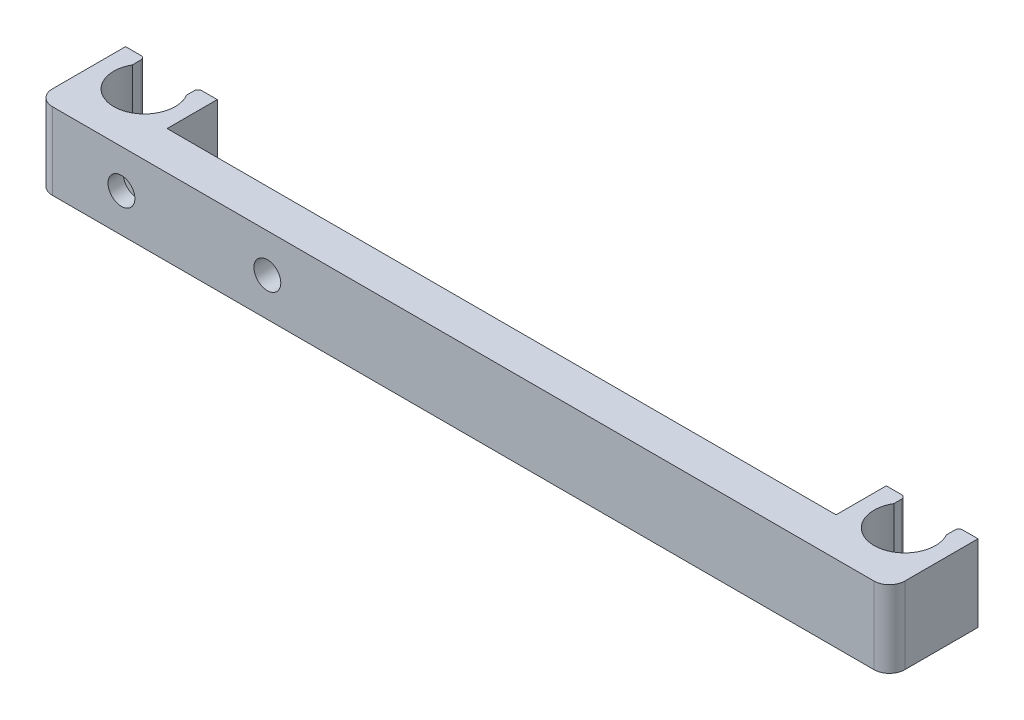
ISO-10303-21;
HEADER;
FILE_DESCRIPTION(('STEP AP214'),'2;1');
FILE_NAME('part.step','',(''),(''),'','','');
FILE_SCHEMA(('AUTOMOTIVE_DESIGN { 1 0 10303 214 1 1 1 1 }'));
ENDSEC;
DATA;
#1=APPLICATION_CONTEXT('core data for automotive mechanical design processes');
#2=APPLICATION_PROTOCOL_DEFINITION('international standard','automotive_design',2000,#1);
#3=PRODUCT_CONTEXT('',#1,'mechanical');
#4=PRODUCT('Part','Part','',(#3));
#5=PRODUCT_RELATED_PRODUCT_CATEGORY('part','',(#4));
#6=PRODUCT_DEFINITION_FORMATION('','',#4);
#7=PRODUCT_DEFINITION_CONTEXT('part definition',#1,'design');
#8=PRODUCT_DEFINITION('design','',#6,#7);
#9=PRODUCT_DEFINITION_SHAPE('','',#8);
#10=(LENGTH_UNIT() NAMED_UNIT(*) SI_UNIT(.MILLI.,.METRE.));
#11=(NAMED_UNIT(*) PLANE_ANGLE_UNIT() SI_UNIT($,.RADIAN.));
#12=(NAMED_UNIT(*) SI_UNIT($,.STERADIAN.) SOLID_ANGLE_UNIT());
#13=UNCERTAINTY_MEASURE_WITH_UNIT(LENGTH_MEASURE(1.E-05),#10,'distance_accuracy_value','');
#14=(GEOMETRIC_REPRESENTATION_CONTEXT(3) GLOBAL_UNCERTAINTY_ASSIGNED_CONTEXT((#13)) GLOBAL_UNIT_ASSIGNED_CONTEXT((#10,
#11,#12)) REPRESENTATION_CONTEXT('',''));
#15=CARTESIAN_POINT('',(0.,0.,0.));
#16=DIRECTION('',(0.,0.,1.));
#17=DIRECTION('',(1.,0.,0.));
#18=AXIS2_PLACEMENT_3D('',#15,#16,#17);
#19=CARTESIAN_POINT('',(-45.5572247146555,10.,-11.0364916731037));
#20=DIRECTION('',(0.,1.,0.));
#21=DIRECTION('',(0.,0.,1.));
#22=AXIS2_PLACEMENT_3D('',#19,#20,#21);
#23=CYLINDRICAL_SURFACE('',#22,0.5);
#24=DIRECTION('',(0.,-1.,0.));
#25=VECTOR('',#24,1.);
#26=CARTESIAN_POINT('',(-46.0572247146555,10.,-11.0364916731037));
#27=LINE('',#26,#25);
#28=CARTESIAN_POINT('',(-46.0572247146555,10.,-11.0364916731037));
#29=VERTEX_POINT('',#28);
#30=CARTESIAN_POINT('',(-46.0572247146555,0.,-11.0364916731037));
#31=VERTEX_POINT('',#30);
#32=EDGE_CURVE('E262',#29,#31,#27,.T.);
#33=ORIENTED_EDGE('',*,*,#32,.F.);
#34=CARTESIAN_POINT('',(-45.5572247146555,10.,-11.0364916731037));
#35=DIRECTION('',(0.,-1.,0.));
#36=DIRECTION('',(0.,0.,-1.));
#37=AXIS2_PLACEMENT_3D('',#34,#35,#36);
#38=CIRCLE('',#37,0.5);
#39=CARTESIAN_POINT('',(-45.5572247146555,10.,-11.5364916731037));
#40=VERTEX_POINT('',#39);
#41=EDGE_CURVE('E41',#40,#29,#38,.F.);
#42=ORIENTED_EDGE('',*,*,#41,.F.);
#43=DIRECTION('',(0.,-1.,0.));
#44=VECTOR('',#43,1.);
#45=CARTESIAN_POINT('',(-45.5572247146555,10.,-11.5364916731037));
#46=LINE('',#45,#44);
#47=CARTESIAN_POINT('',(-45.5572247146555,0.,-11.5364916731037));
#48=VERTEX_POINT('',#47);
#49=EDGE_CURVE('E265',#48,#40,#46,.F.);
#50=ORIENTED_EDGE('',*,*,#49,.F.);
#51=CARTESIAN_POINT('',(-45.5572247146555,0.,-11.0364916731037));
#52=DIRECTION('',(0.,-1.,0.));
#53=DIRECTION('',(0.,0.,-1.));
#54=AXIS2_PLACEMENT_3D('',#51,#52,#53);
#55=CIRCLE('',#54,0.5);
#56=EDGE_CURVE('E11',#31,#48,#55,.T.);
#57=ORIENTED_EDGE('',*,*,#56,.F.);
#58=EDGE_LOOP('',(#33,#42,#50,#57));
#59=FACE_BOUND('',#58,.T.);
#60=ADVANCED_FACE('F34',(#59),#23,.T.);
#61=CARTESIAN_POINT('',(-53.5,10.,-11.0364916731037));
#62=DIRECTION('',(0.,1.,0.));
#63=DIRECTION('',(0.,0.,1.));
#64=AXIS2_PLACEMENT_3D('',#61,#62,#63);
#65=CYLINDRICAL_SURFACE('',#64,0.5);
#66=DIRECTION('',(0.,1.,0.));
#67=VECTOR('',#66,1.);
#68=CARTESIAN_POINT('',(-53.,10.,-11.0364916731037));
#69=LINE('',#68,#67);
#70=CARTESIAN_POINT('',(-53.,0.,-11.0364916731037));
#71=VERTEX_POINT('',#70);
#72=CARTESIAN_POINT('',(-53.,10.,-11.0364916731037));
#73=VERTEX_POINT('',#72);
#74=EDGE_CURVE('E252',#71,#73,#69,.T.);
#75=ORIENTED_EDGE('',*,*,#74,.F.);
#76=CARTESIAN_POINT('',(-53.5,0.,-11.0364916731037));
#77=DIRECTION('',(0.,-1.,0.));
#78=DIRECTION('',(0.,0.,-1.));
#79=AXIS2_PLACEMENT_3D('',#76,#77,#78);
#80=CIRCLE('',#79,0.5);
#81=CARTESIAN_POINT('',(-53.5,0.,-11.5364916731037));
#82=VERTEX_POINT('',#81);
#83=EDGE_CURVE('E258',#82,#71,#80,.T.);
#84=ORIENTED_EDGE('',*,*,#83,.F.);
#85=DIRECTION('',(0.,1.,0.));
#86=VECTOR('',#85,1.);
#87=CARTESIAN_POINT('',(-53.5,10.,-11.5364916731037));
#88=LINE('',#87,#86);
#89=CARTESIAN_POINT('',(-53.5,10.,-11.5364916731037));
#90=VERTEX_POINT('',#89);
#91=EDGE_CURVE('E255',#90,#82,#88,.F.);
#92=ORIENTED_EDGE('',*,*,#91,.F.);
#93=CARTESIAN_POINT('',(-53.5,10.,-11.0364916731037));
#94=DIRECTION('',(0.,-1.,0.));
#95=DIRECTION('',(0.,0.,-1.));
#96=AXIS2_PLACEMENT_3D('',#93,#94,#95);
#97=CIRCLE('',#96,0.5);
#98=EDGE_CURVE('E260',#73,#90,#97,.F.);
#99=ORIENTED_EDGE('',*,*,#98,.F.);
#100=EDGE_LOOP('',(#75,#84,#92,#99));
#101=FACE_BOUND('',#100,.T.);
#102=ADVANCED_FACE('F425',(#101),#65,.T.);
#103=CARTESIAN_POINT('',(53.5,10.,-11.0364916731037));
#104=DIRECTION('',(0.,-1.,0.));
#105=DIRECTION('',(0.,0.,-1.));
#106=AXIS2_PLACEMENT_3D('',#103,#104,#105);
#107=CYLINDRICAL_SURFACE('',#106,0.5);
#108=DIRECTION('',(0.,-1.,0.));
#109=VECTOR('',#108,1.);
#110=CARTESIAN_POINT('',(53.,10.,-11.0364916731037));
#111=LINE('',#110,#109);
#112=CARTESIAN_POINT('',(53.,10.,-11.0364916731037));
#113=VERTEX_POINT('',#112);
#114=CARTESIAN_POINT('',(53.,0.,-11.0364916731037));
#115=VERTEX_POINT('',#114);
#116=EDGE_CURVE('E242',#113,#115,#111,.T.);
#117=ORIENTED_EDGE('',*,*,#116,.F.);
#118=CARTESIAN_POINT('',(53.5,10.,-11.0364916731037));
#119=DIRECTION('',(0.,-1.,0.));
#120=DIRECTION('',(0.,0.,-1.));
#121=AXIS2_PLACEMENT_3D('',#118,#119,#120);
#122=CIRCLE('',#121,0.5);
#123=CARTESIAN_POINT('',(53.5,10.,-11.5364916731037));
#124=VERTEX_POINT('',#123);
#125=EDGE_CURVE('E248',#124,#113,#122,.F.);
#126=ORIENTED_EDGE('',*,*,#125,.F.);
#127=DIRECTION('',(0.,-1.,0.));
#128=VECTOR('',#127,1.);
#129=CARTESIAN_POINT('',(53.5,10.,-11.5364916731037));
#130=LINE('',#129,#128);
#131=CARTESIAN_POINT('',(53.5,0.,-11.5364916731037));
#132=VERTEX_POINT('',#131);
#133=EDGE_CURVE('E245',#132,#124,#130,.F.);
#134=ORIENTED_EDGE('',*,*,#133,.F.);
#135=CARTESIAN_POINT('',(53.5,0.,-11.0364916731037));
#136=DIRECTION('',(0.,-1.,0.));
#137=DIRECTION('',(0.,0.,-1.));
#138=AXIS2_PLACEMENT_3D('',#135,#136,#137);
#139=CIRCLE('',#138,0.5);
#140=EDGE_CURVE('E250',#115,#132,#139,.T.);
#141=ORIENTED_EDGE('',*,*,#140,.F.);
#142=EDGE_LOOP('',(#117,#126,#134,#141));
#143=FACE_BOUND('',#142,.T.);
#144=ADVANCED_FACE('F389',(#143),#107,.T.);
#145=CARTESIAN_POINT('',(45.5572247146555,10.,-11.0364916731037));
#146=DIRECTION('',(0.,-1.,0.));
#147=DIRECTION('',(0.,0.,-1.));
#148=AXIS2_PLACEMENT_3D('',#145,#146,#147);
#149=CYLINDRICAL_SURFACE('',#148,0.5);
#150=DIRECTION('',(0.,1.,0.));
#151=VECTOR('',#150,1.);
#152=CARTESIAN_POINT('',(46.0572247146555,10.,-11.0364916731037));
#153=LINE('',#152,#151);
#154=CARTESIAN_POINT('',(46.0572247146555,0.,-11.0364916731037));
#155=VERTEX_POINT('',#154);
#156=CARTESIAN_POINT('',(46.0572247146555,10.,-11.0364916731037));
#157=VERTEX_POINT('',#156);
#158=EDGE_CURVE('E232',#155,#157,#153,.T.);
#159=ORIENTED_EDGE('',*,*,#158,.F.);
#160=CARTESIAN_POINT('',(45.5572247146555,0.,-11.0364916731037));
#161=DIRECTION('',(0.,-1.,0.));
#162=DIRECTION('',(0.,0.,-1.));
#163=AXIS2_PLACEMENT_3D('',#160,#161,#162);
#164=CIRCLE('',#163,0.5);
#165=CARTESIAN_POINT('',(45.5572247146555,0.,-11.5364916731037));
#166=VERTEX_POINT('',#165);
#167=EDGE_CURVE('E238',#166,#155,#164,.T.);
#168=ORIENTED_EDGE('',*,*,#167,.F.);
#169=DIRECTION('',(0.,1.,0.));
#170=VECTOR('',#169,1.);
#171=CARTESIAN_POINT('',(45.5572247146555,10.,-11.5364916731037));
#172=LINE('',#171,#170);
#173=CARTESIAN_POINT('',(45.5572247146555,10.,-11.5364916731037));
#174=VERTEX_POINT('',#173);
#175=EDGE_CURVE('E235',#174,#166,#172,.F.);
#176=ORIENTED_EDGE('',*,*,#175,.F.);
#177=CARTESIAN_POINT('',(45.5572247146555,10.,-11.0364916731037));
#178=DIRECTION('',(0.,-1.,0.));
#179=DIRECTION('',(0.,0.,-1.));
#180=AXIS2_PLACEMENT_3D('',#177,#178,#179);
#181=CIRCLE('',#180,0.5);
#182=EDGE_CURVE('E240',#157,#174,#181,.F.);
#183=ORIENTED_EDGE('',*,*,#182,.F.);
#184=EDGE_LOOP('',(#159,#168,#176,#183));
#185=FACE_BOUND('',#184,.T.);
#186=ADVANCED_FACE('F372',(#185),#149,.T.);
#187=CARTESIAN_POINT('',(-53.5,10.,-2.));
#188=DIRECTION('',(0.,-1.,0.));
#189=DIRECTION('',(0.,0.,-1.));
#190=AXIS2_PLACEMENT_3D('',#187,#188,#189);
#191=CYLINDRICAL_SURFACE('',#190,2.);
#192=DIRECTION('',(0.,1.,0.));
#193=VECTOR('',#192,1.);
#194=CARTESIAN_POINT('',(-55.5,10.,-2.));
#195=LINE('',#194,#193);
#196=CARTESIAN_POINT('',(-55.5,0.,-2.));
#197=VERTEX_POINT('',#196);
#198=CARTESIAN_POINT('',(-55.5,10.,-2.));
#199=VERTEX_POINT('',#198);
#200=EDGE_CURVE('E222',#197,#199,#195,.T.);
#201=ORIENTED_EDGE('',*,*,#200,.F.);
#202=CARTESIAN_POINT('',(-53.5,0.,-2.));
#203=DIRECTION('',(0.,-1.,0.));
#204=DIRECTION('',(0.,0.,-1.));
#205=AXIS2_PLACEMENT_3D('',#202,#203,#204);
#206=CIRCLE('',#205,2.);
#207=CARTESIAN_POINT('',(-53.5,0.,0.));
#208=VERTEX_POINT('',#207);
#209=EDGE_CURVE('E228',#208,#197,#206,.T.);
#210=ORIENTED_EDGE('',*,*,#209,.F.);
#211=DIRECTION('',(0.,1.,0.));
#212=VECTOR('',#211,1.);
#213=CARTESIAN_POINT('',(-53.5,10.,0.));
#214=LINE('',#213,#212);
#215=CARTESIAN_POINT('',(-53.5,10.,0.));
#216=VERTEX_POINT('',#215);
#217=EDGE_CURVE('E225',#216,#208,#214,.F.);
#218=ORIENTED_EDGE('',*,*,#217,.F.);
#219=CARTESIAN_POINT('',(-53.5,10.,-2.));
#220=DIRECTION('',(0.,-1.,0.));
#221=DIRECTION('',(0.,0.,-1.));
#222=AXIS2_PLACEMENT_3D('',#219,#220,#221);
#223=CIRCLE('',#222,2.);
#224=EDGE_CURVE('E230',#199,#216,#223,.F.);
#225=ORIENTED_EDGE('',*,*,#224,.F.);
#226=EDGE_LOOP('',(#201,#210,#218,#225));
#227=FACE_BOUND('',#226,.T.);
#228=ADVANCED_FACE('F412',(#227),#191,.T.);
#229=CARTESIAN_POINT('',(53.5,10.,-2.));
#230=DIRECTION('',(0.,-1.,0.));
#231=DIRECTION('',(0.,0.,-1.));
#232=AXIS2_PLACEMENT_3D('',#229,#230,#231);
#233=CYLINDRICAL_SURFACE('',#232,2.);
#234=DIRECTION('',(0.,-1.,0.));
#235=VECTOR('',#234,1.);
#236=CARTESIAN_POINT('',(55.5,10.,-2.));
#237=LINE('',#236,#235);
#238=CARTESIAN_POINT('',(55.5,10.,-2.));
#239=VERTEX_POINT('',#238);
#240=CARTESIAN_POINT('',(55.5,0.,-2.));
#241=VERTEX_POINT('',#240);
#242=EDGE_CURVE('E206',#239,#241,#237,.T.);
#243=ORIENTED_EDGE('',*,*,#242,.F.);
#244=CARTESIAN_POINT('',(53.5,10.,-2.));
#245=DIRECTION('',(0.,-1.,0.));
#246=DIRECTION('',(0.,0.,-1.));
#247=AXIS2_PLACEMENT_3D('',#244,#245,#246);
#248=CIRCLE('',#247,2.);
#249=CARTESIAN_POINT('',(53.5,10.,0.));
#250=VERTEX_POINT('',#249);
#251=EDGE_CURVE('E217',#250,#239,#248,.F.);
#252=ORIENTED_EDGE('',*,*,#251,.F.);
#253=DIRECTION('',(0.,-1.,0.));
#254=VECTOR('',#253,1.);
#255=CARTESIAN_POINT('',(53.5,10.,0.));
#256=LINE('',#255,#254);
#257=CARTESIAN_POINT('',(53.5,0.,0.));
#258=VERTEX_POINT('',#257);
#259=EDGE_CURVE('E209',#258,#250,#256,.F.);
#260=ORIENTED_EDGE('',*,*,#259,.F.);
#261=CARTESIAN_POINT('',(53.5,0.,-2.));
#262=DIRECTION('',(0.,-1.,0.));
#263=DIRECTION('',(0.,0.,-1.));
#264=AXIS2_PLACEMENT_3D('',#261,#262,#263);
#265=CIRCLE('',#264,2.);
#266=EDGE_CURVE('E219',#241,#258,#265,.T.);
#267=ORIENTED_EDGE('',*,*,#266,.F.);
#268=EDGE_LOOP('',(#243,#252,#260,#267));
#269=FACE_BOUND('',#268,.T.);
#270=ADVANCED_FACE('F403',(#269),#233,.T.);
#271=CARTESIAN_POINT('',(43.5572247146555,10.,-11.5364916731037));
#272=DIRECTION('',(1.,0.,0.));
#273=DIRECTION('',(0.,0.,-1.));
#274=AXIS2_PLACEMENT_3D('',#271,#272,#273);
#275=PLANE('',#274);
#276=DIRECTION('',(0.,0.,1.));
#277=VECTOR('',#276,1.);
#278=CARTESIAN_POINT('',(43.5572247146555,0.,-11.5364916731037));
#279=LINE('',#278,#277);
#280=CARTESIAN_POINT('',(43.5572247146555,0.,-11.5364916731037));
#281=VERTEX_POINT('',#280);
#282=CARTESIAN_POINT('',(43.5572247146555,0.,-4.99999999999999));
#283=VERTEX_POINT('',#282);
#284=EDGE_CURVE('E205',#281,#283,#279,.T.);
#285=ORIENTED_EDGE('',*,*,#284,.T.);
#286=DIRECTION('',(0.,-1.,0.));
#287=VECTOR('',#286,1.);
#288=CARTESIAN_POINT('',(43.5572247146555,10.,-4.99999999999999));
#289=LINE('',#288,#287);
#290=CARTESIAN_POINT('',(43.5572247146555,10.,-4.99999999999999));
#291=VERTEX_POINT('',#290);
#292=EDGE_CURVE('E184',#291,#283,#289,.T.);
#293=ORIENTED_EDGE('',*,*,#292,.F.);
#294=DIRECTION('',(0.,0.,1.));
#295=VECTOR('',#294,1.);
#296=CARTESIAN_POINT('',(43.5572247146555,10.,-11.5364916731037));
#297=LINE('',#296,#295);
#298=CARTESIAN_POINT('',(43.5572247146555,10.,-11.5364916731037));
#299=VERTEX_POINT('',#298);
#300=EDGE_CURVE('E191',#299,#291,#297,.T.);
#301=ORIENTED_EDGE('',*,*,#300,.F.);
#302=DIRECTION('',(0.,-1.,0.));
#303=VECTOR('',#302,1.);
#304=CARTESIAN_POINT('',(43.5572247146555,10.,-11.5364916731037));
#305=LINE('',#304,#303);
#306=EDGE_CURVE('E304',#299,#281,#305,.T.);
#307=ORIENTED_EDGE('',*,*,#306,.T.);
#308=EDGE_LOOP('',(#285,#293,#301,#307));
#309=FACE_BOUND('',#308,.T.);
#310=ADVANCED_FACE('F203',(#309),#275,.F.);
#311=CARTESIAN_POINT('',(43.5572247146555,10.,-4.99999999999999));
#312=DIRECTION('',(0.,0.,1.));
#313=DIRECTION('',(1.,0.,0.));
#314=AXIS2_PLACEMENT_3D('',#311,#312,#313);
#315=PLANE('',#314);
#316=CARTESIAN_POINT('',(-25.5,5.,-5.));
#317=DIRECTION('',(0.,0.,1.));
#318=DIRECTION('',(1.,0.,0.));
#319=AXIS2_PLACEMENT_3D('',#316,#317,#318);
#320=CIRCLE('',#319,1.75);
#321=CARTESIAN_POINT('',(-23.75,5.,-5.));
#322=VERTEX_POINT('',#321);
#323=EDGE_CURVE('E307',#322,#322,#320,.T.);
#324=ORIENTED_EDGE('',*,*,#323,.T.);
#325=EDGE_LOOP('',(#324));
#326=FACE_BOUND('',#325,.T.);
#327=DIRECTION('',(-1.,0.,0.));
#328=VECTOR('',#327,1.);
#329=CARTESIAN_POINT('',(43.5572247146555,0.,-4.99999999999999));
#330=LINE('',#329,#328);
#331=CARTESIAN_POINT('',(-43.5572247146555,0.,-4.99999999999999));
#332=VERTEX_POINT('',#331);
#333=EDGE_CURVE('E306',#283,#332,#330,.T.);
#334=ORIENTED_EDGE('',*,*,#333,.T.);
#335=DIRECTION('',(0.,-1.,0.));
#336=VECTOR('',#335,1.);
#337=CARTESIAN_POINT('',(-43.5572247146555,10.,-4.99999999999999));
#338=LINE('',#337,#336);
#339=CARTESIAN_POINT('',(-43.5572247146555,10.,-4.99999999999999));
#340=VERTEX_POINT('',#339);
#341=EDGE_CURVE('E186',#340,#332,#338,.T.);
#342=ORIENTED_EDGE('',*,*,#341,.F.);
#343=DIRECTION('',(-1.,0.,0.));
#344=VECTOR('',#343,1.);
#345=CARTESIAN_POINT('',(43.5572247146555,10.,-4.99999999999999));
#346=LINE('',#345,#344);
#347=EDGE_CURVE('E179',#291,#340,#346,.T.);
#348=ORIENTED_EDGE('',*,*,#347,.F.);
#349=ORIENTED_EDGE('',*,*,#292,.T.);
#350=EDGE_LOOP('',(#334,#342,#348,#349));
#351=FACE_BOUND('',#350,.T.);
#352=ADVANCED_FACE('F182',(#326,#351),#315,.F.);
#353=CARTESIAN_POINT('',(-43.5572247146555,10.,-11.5364916731037));
#354=DIRECTION('',(1.,0.,0.));
#355=DIRECTION('',(0.,0.,-1.));
#356=AXIS2_PLACEMENT_3D('',#353,#354,#355);
#357=PLANE('',#356);
#358=DIRECTION('',(0.,0.,1.));
#359=VECTOR('',#358,1.);
#360=CARTESIAN_POINT('',(-43.5572247146555,0.,-11.5364916731037));
#361=LINE('',#360,#359);
#362=CARTESIAN_POINT('',(-43.5572247146555,0.,-11.5364916731037));
#363=VERTEX_POINT('',#362);
#364=EDGE_CURVE('E309',#363,#332,#361,.T.);
#365=ORIENTED_EDGE('',*,*,#364,.F.);
#366=DIRECTION('',(0.,-1.,0.));
#367=VECTOR('',#366,1.);
#368=CARTESIAN_POINT('',(-43.5572247146555,10.,-11.5364916731037));
#369=LINE('',#368,#367);
#370=CARTESIAN_POINT('',(-43.5572247146555,10.,-11.5364916731037));
#371=VERTEX_POINT('',#370);
#372=EDGE_CURVE('E211',#371,#363,#369,.T.);
#373=ORIENTED_EDGE('',*,*,#372,.F.);
#374=DIRECTION('',(0.,0.,1.));
#375=VECTOR('',#374,1.);
#376=CARTESIAN_POINT('',(-43.5572247146555,10.,-11.5364916731037));
#377=LINE('',#376,#375);
#378=EDGE_CURVE('E190',#371,#340,#377,.T.);
#379=ORIENTED_EDGE('',*,*,#378,.T.);
#380=ORIENTED_EDGE('',*,*,#341,.T.);
#381=EDGE_LOOP('',(#365,#373,#379,#380));
#382=FACE_BOUND('',#381,.T.);
#383=ADVANCED_FACE('F364',(#382),#357,.T.);
#384=CARTESIAN_POINT('',(-46.0572247146555,10.,-11.5364916731037));
#385=DIRECTION('',(0.,0.,-1.));
#386=DIRECTION('',(-1.,0.,0.));
#387=AXIS2_PLACEMENT_3D('',#384,#385,#386);
#388=PLANE('',#387);
#389=DIRECTION('',(1.,0.,0.));
#390=VECTOR('',#389,1.);
#391=CARTESIAN_POINT('',(-46.0572247146555,0.,-11.5364916731037));
#392=LINE('',#391,#390);
#393=EDGE_CURVE('E312',#48,#363,#392,.T.);
#394=ORIENTED_EDGE('',*,*,#393,.F.);
#395=ORIENTED_EDGE('',*,*,#49,.T.);
#396=DIRECTION('',(1.,0.,0.));
#397=VECTOR('',#396,1.);
#398=CARTESIAN_POINT('',(-46.0572247146555,10.,-11.5364916731037));
#399=LINE('',#398,#397);
#400=EDGE_CURVE('E270',#40,#371,#399,.T.);
#401=ORIENTED_EDGE('',*,*,#400,.T.);
#402=ORIENTED_EDGE('',*,*,#372,.T.);
#403=EDGE_LOOP('',(#394,#395,#401,#402));
#404=FACE_BOUND('',#403,.T.);
#405=ADVANCED_FACE('F362',(#404),#388,.T.);
#406=CARTESIAN_POINT('',(-46.0572247146555,10.,-11.5364916731037));
#407=DIRECTION('',(1.,0.,0.));
#408=DIRECTION('',(0.,0.,-1.));
#409=AXIS2_PLACEMENT_3D('',#406,#407,#408);
#410=PLANE('',#409);
#411=DIRECTION('',(0.,0.,1.));
#412=VECTOR('',#411,1.);
#413=CARTESIAN_POINT('',(-46.0572247146555,10.,-11.5364916731037));
#414=LINE('',#413,#412);
#415=CARTESIAN_POINT('',(-46.0572247146555,10.,-10.0364916731037));
#416=VERTEX_POINT('',#415);
#417=EDGE_CURVE('E268',#29,#416,#414,.T.);
#418=ORIENTED_EDGE('',*,*,#417,.F.);
#419=ORIENTED_EDGE('',*,*,#32,.T.);
#420=DIRECTION('',(0.,0.,1.));
#421=VECTOR('',#420,1.);
#422=CARTESIAN_POINT('',(-46.0572247146555,0.,-11.5364916731037));
#423=LINE('',#422,#421);
#424=CARTESIAN_POINT('',(-46.0572247146555,0.,-10.0364916731037));
#425=VERTEX_POINT('',#424);
#426=EDGE_CURVE('E314',#31,#425,#423,.T.);
#427=ORIENTED_EDGE('',*,*,#426,.T.);
#428=DIRECTION('',(0.,-1.,0.));
#429=VECTOR('',#428,1.);
#430=CARTESIAN_POINT('',(-46.0572247146555,10.,-10.0364916731037));
#431=LINE('',#430,#429);
#432=EDGE_CURVE('E274',#416,#425,#431,.T.);
#433=ORIENTED_EDGE('',*,*,#432,.F.);
#434=EDGE_LOOP('',(#418,#419,#427,#433));
#435=FACE_BOUND('',#434,.T.);
#436=ADVANCED_FACE('F272',(#435),#410,.F.);
#437=CARTESIAN_POINT('',(-49.5,10.,-8.00000000000001));
#438=DIRECTION('',(0.,-1.,0.));
#439=DIRECTION('',(0.,0.,-1.));
#440=AXIS2_PLACEMENT_3D('',#437,#438,#439);
#441=CYLINDRICAL_SURFACE('',#440,3.99999999999998);
#442=CARTESIAN_POINT('',(-49.5,0.,-8.00000000000001));
#443=DIRECTION('',(0.,-1.,0.));
#444=DIRECTION('',(0.,0.,-1.));
#445=AXIS2_PLACEMENT_3D('',#442,#443,#444);
#446=CIRCLE('',#445,3.99999999999998);
#447=CARTESIAN_POINT('',(-53.,0.,-9.93649167310367));
#448=VERTEX_POINT('',#447);
#449=EDGE_CURVE('E316',#425,#448,#446,.T.);
#450=ORIENTED_EDGE('',*,*,#449,.T.);
#451=DIRECTION('',(0.,-1.,0.));
#452=VECTOR('',#451,1.);
#453=CARTESIAN_POINT('',(-53.,10.,-9.93649167310367));
#454=LINE('',#453,#452);
#455=CARTESIAN_POINT('',(-53.,10.,-9.93649167310367));
#456=VERTEX_POINT('',#455);
#457=EDGE_CURVE('E354',#456,#448,#454,.T.);
#458=ORIENTED_EDGE('',*,*,#457,.F.);
#459=CARTESIAN_POINT('',(-49.5,10.,-8.00000000000001));
#460=DIRECTION('',(0.,-1.,0.));
#461=DIRECTION('',(0.,0.,-1.));
#462=AXIS2_PLACEMENT_3D('',#459,#460,#461);
#463=CIRCLE('',#462,3.99999999999998);
#464=EDGE_CURVE('E276',#416,#456,#463,.T.);
#465=ORIENTED_EDGE('',*,*,#464,.F.);
#466=ORIENTED_EDGE('',*,*,#432,.T.);
#467=EDGE_LOOP('',(#450,#458,#465,#466));
#468=FACE_BOUND('',#467,.T.);
#469=ADVANCED_FACE('F433',(#468),#441,.F.);
#470=CARTESIAN_POINT('',(-53.,10.,-11.5364916731037));
#471=DIRECTION('',(1.,0.,0.));
#472=DIRECTION('',(0.,0.,-1.));
#473=AXIS2_PLACEMENT_3D('',#470,#471,#472);
#474=PLANE('',#473);
#475=DIRECTION('',(0.,0.,1.));
#476=VECTOR('',#475,1.);
#477=CARTESIAN_POINT('',(-53.,0.,-11.5364916731037));
#478=LINE('',#477,#476);
#479=EDGE_CURVE('E319',#71,#448,#478,.T.);
#480=ORIENTED_EDGE('',*,*,#479,.F.);
#481=ORIENTED_EDGE('',*,*,#74,.T.);
#482=DIRECTION('',(0.,0.,1.));
#483=VECTOR('',#482,1.);
#484=CARTESIAN_POINT('',(-53.,10.,-11.5364916731037));
#485=LINE('',#484,#483);
#486=EDGE_CURVE('E278',#73,#456,#485,.T.);
#487=ORIENTED_EDGE('',*,*,#486,.T.);
#488=ORIENTED_EDGE('',*,*,#457,.T.);
#489=EDGE_LOOP('',(#480,#481,#487,#488));
#490=FACE_BOUND('',#489,.T.);
#491=ADVANCED_FACE('F429',(#490),#474,.T.);
#492=CARTESIAN_POINT('',(-55.5,10.,-11.5364916731037));
#493=DIRECTION('',(0.,0.,-1.));
#494=DIRECTION('',(-1.,0.,0.));
#495=AXIS2_PLACEMENT_3D('',#492,#493,#494);
#496=PLANE('',#495);
#497=DIRECTION('',(1.,0.,0.));
#498=VECTOR('',#497,1.);
#499=CARTESIAN_POINT('',(-55.5,10.,-11.5364916731037));
#500=LINE('',#499,#498);
#501=CARTESIAN_POINT('',(-55.5,10.,-11.5364916731037));
#502=VERTEX_POINT('',#501);
#503=EDGE_CURVE('E284',#502,#90,#500,.T.);
#504=ORIENTED_EDGE('',*,*,#503,.T.);
#505=ORIENTED_EDGE('',*,*,#91,.T.);
#506=DIRECTION('',(1.,0.,0.));
#507=VECTOR('',#506,1.);
#508=CARTESIAN_POINT('',(-55.5,0.,-11.5364916731037));
#509=LINE('',#508,#507);
#510=CARTESIAN_POINT('',(-55.5,0.,-11.5364916731037));
#511=VERTEX_POINT('',#510);
#512=EDGE_CURVE('E321',#511,#82,#509,.T.);
#513=ORIENTED_EDGE('',*,*,#512,.F.);
#514=DIRECTION('',(0.,-1.,0.));
#515=VECTOR('',#514,1.);
#516=CARTESIAN_POINT('',(-55.5,10.,-11.5364916731037));
#517=LINE('',#516,#515);
#518=EDGE_CURVE('E351',#502,#511,#517,.T.);
#519=ORIENTED_EDGE('',*,*,#518,.F.);
#520=EDGE_LOOP('',(#504,#505,#513,#519));
#521=FACE_BOUND('',#520,.T.);
#522=ADVANCED_FACE('F421',(#521),#496,.T.);
#523=CARTESIAN_POINT('',(-55.5,10.,0.));
#524=DIRECTION('',(-1.,0.,0.));
#525=DIRECTION('',(0.,0.,1.));
#526=AXIS2_PLACEMENT_3D('',#523,#524,#525);
#527=PLANE('',#526);
#528=DIRECTION('',(0.,0.,-1.));
#529=VECTOR('',#528,1.);
#530=CARTESIAN_POINT('',(-55.5,0.,0.));
#531=LINE('',#530,#529);
#532=EDGE_CURVE('E324',#197,#511,#531,.T.);
#533=ORIENTED_EDGE('',*,*,#532,.F.);
#534=ORIENTED_EDGE('',*,*,#200,.T.);
#535=DIRECTION('',(0.,0.,-1.));
#536=VECTOR('',#535,1.);
#537=CARTESIAN_POINT('',(-55.5,10.,0.));
#538=LINE('',#537,#536);
#539=EDGE_CURVE('E287',#199,#502,#538,.T.);
#540=ORIENTED_EDGE('',*,*,#539,.T.);
#541=ORIENTED_EDGE('',*,*,#518,.T.);
#542=EDGE_LOOP('',(#533,#534,#540,#541));
#543=FACE_BOUND('',#542,.T.);
#544=ADVANCED_FACE('F416',(#543),#527,.T.);
#545=CARTESIAN_POINT('',(-55.5,10.,0.));
#546=DIRECTION('',(0.,0.,-1.));
#547=DIRECTION('',(-1.,0.,0.));
#548=AXIS2_PLACEMENT_3D('',#545,#546,#547);
#549=PLANE('',#548);
#550=CARTESIAN_POINT('',(-44.5,5.,0.));
#551=DIRECTION('',(0.,0.,1.));
#552=DIRECTION('',(1.,0.,0.));
#553=AXIS2_PLACEMENT_3D('',#550,#551,#552);
#554=CIRCLE('',#553,1.75);
#555=CARTESIAN_POINT('',(-42.75,5.,0.));
#556=VERTEX_POINT('',#555);
#557=EDGE_CURVE('E660',#556,#556,#554,.T.);
#558=ORIENTED_EDGE('',*,*,#557,.F.);
#559=EDGE_LOOP('',(#558));
#560=FACE_BOUND('',#559,.T.);
#561=CARTESIAN_POINT('',(-25.5,5.,0.));
#562=DIRECTION('',(0.,0.,1.));
#563=DIRECTION('',(1.,0.,0.));
#564=AXIS2_PLACEMENT_3D('',#561,#562,#563);
#565=CIRCLE('',#564,1.75);
#566=CARTESIAN_POINT('',(-23.75,5.,0.));
#567=VERTEX_POINT('',#566);
#568=EDGE_CURVE('E659',#567,#567,#565,.T.);
#569=ORIENTED_EDGE('',*,*,#568,.F.);
#570=EDGE_LOOP('',(#569));
#571=FACE_BOUND('',#570,.T.);
#572=DIRECTION('',(1.,0.,0.));
#573=VECTOR('',#572,1.);
#574=CARTESIAN_POINT('',(-55.5,10.,0.));
#575=LINE('',#574,#573);
#576=EDGE_CURVE('E289',#216,#250,#575,.T.);
#577=ORIENTED_EDGE('',*,*,#576,.F.);
#578=ORIENTED_EDGE('',*,*,#217,.T.);
#579=DIRECTION('',(1.,0.,0.));
#580=VECTOR('',#579,1.);
#581=CARTESIAN_POINT('',(-55.5,0.,0.));
#582=LINE('',#581,#580);
#583=EDGE_CURVE('E326',#208,#258,#582,.T.);
#584=ORIENTED_EDGE('',*,*,#583,.T.);
#585=ORIENTED_EDGE('',*,*,#259,.T.);
#586=EDGE_LOOP('',(#577,#578,#584,#585));
#587=FACE_BOUND('',#586,.T.);
#588=ADVANCED_FACE('F409',(#560,#571,#587),#549,.F.);
#589=CARTESIAN_POINT('',(55.5,10.,0.));
#590=DIRECTION('',(-1.,0.,0.));
#591=DIRECTION('',(0.,0.,1.));
#592=AXIS2_PLACEMENT_3D('',#589,#590,#591);
#593=PLANE('',#592);
#594=DIRECTION('',(0.,0.,-1.));
#595=VECTOR('',#594,1.);
#596=CARTESIAN_POINT('',(55.5,10.,0.));
#597=LINE('',#596,#595);
#598=CARTESIAN_POINT('',(55.5,10.,-11.5364916731037));
#599=VERTEX_POINT('',#598);
#600=EDGE_CURVE('E291',#239,#599,#597,.T.);
#601=ORIENTED_EDGE('',*,*,#600,.F.);
#602=ORIENTED_EDGE('',*,*,#242,.T.);
#603=DIRECTION('',(0.,0.,-1.));
#604=VECTOR('',#603,1.);
#605=CARTESIAN_POINT('',(55.5,0.,0.));
#606=LINE('',#605,#604);
#607=CARTESIAN_POINT('',(55.5,0.,-11.5364916731037));
#608=VERTEX_POINT('',#607);
#609=EDGE_CURVE('E328',#241,#608,#606,.T.);
#610=ORIENTED_EDGE('',*,*,#609,.T.);
#611=DIRECTION('',(0.,-1.,0.));
#612=VECTOR('',#611,1.);
#613=CARTESIAN_POINT('',(55.5,10.,-11.5364916731037));
#614=LINE('',#613,#612);
#615=EDGE_CURVE('E348',#599,#608,#614,.T.);
#616=ORIENTED_EDGE('',*,*,#615,.F.);
#617=EDGE_LOOP('',(#601,#602,#610,#616));
#618=FACE_BOUND('',#617,.T.);
#619=ADVANCED_FACE('F399',(#618),#593,.F.);
#620=CARTESIAN_POINT('',(55.5,10.,-11.5364916731037));
#621=DIRECTION('',(0.,0.,1.));
#622=DIRECTION('',(1.,0.,0.));
#623=AXIS2_PLACEMENT_3D('',#620,#621,#622);
#624=PLANE('',#623);
#625=DIRECTION('',(-1.,0.,0.));
#626=VECTOR('',#625,1.);
#627=CARTESIAN_POINT('',(55.5,0.,-11.5364916731037));
#628=LINE('',#627,#626);
#629=EDGE_CURVE('E330',#608,#132,#628,.T.);
#630=ORIENTED_EDGE('',*,*,#629,.T.);
#631=ORIENTED_EDGE('',*,*,#133,.T.);
#632=DIRECTION('',(-1.,0.,0.));
#633=VECTOR('',#632,1.);
#634=CARTESIAN_POINT('',(55.5,10.,-11.5364916731037));
#635=LINE('',#634,#633);
#636=EDGE_CURVE('E293',#599,#124,#635,.T.);
#637=ORIENTED_EDGE('',*,*,#636,.F.);
#638=ORIENTED_EDGE('',*,*,#615,.T.);
#639=EDGE_LOOP('',(#630,#631,#637,#638));
#640=FACE_BOUND('',#639,.T.);
#641=ADVANCED_FACE('F394',(#640),#624,.F.);
#642=CARTESIAN_POINT('',(53.,10.,-11.5364916731037));
#643=DIRECTION('',(1.,0.,0.));
#644=DIRECTION('',(0.,0.,-1.));
#645=AXIS2_PLACEMENT_3D('',#642,#643,#644);
#646=PLANE('',#645);
#647=DIRECTION('',(0.,0.,1.));
#648=VECTOR('',#647,1.);
#649=CARTESIAN_POINT('',(53.,10.,-11.5364916731037));
#650=LINE('',#649,#648);
#651=CARTESIAN_POINT('',(53.,10.,-9.93649167310368));
#652=VERTEX_POINT('',#651);
#653=EDGE_CURVE('E296',#113,#652,#650,.T.);
#654=ORIENTED_EDGE('',*,*,#653,.F.);
#655=ORIENTED_EDGE('',*,*,#116,.T.);
#656=DIRECTION('',(0.,0.,1.));
#657=VECTOR('',#656,1.);
#658=CARTESIAN_POINT('',(53.,0.,-11.5364916731037));
#659=LINE('',#658,#657);
#660=CARTESIAN_POINT('',(53.,0.,-9.93649167310368));
#661=VERTEX_POINT('',#660);
#662=EDGE_CURVE('E333',#115,#661,#659,.T.);
#663=ORIENTED_EDGE('',*,*,#662,.T.);
#664=DIRECTION('',(0.,-1.,0.));
#665=VECTOR('',#664,1.);
#666=CARTESIAN_POINT('',(53.,10.,-9.93649167310368));
#667=LINE('',#666,#665);
#668=EDGE_CURVE('E345',#652,#661,#667,.T.);
#669=ORIENTED_EDGE('',*,*,#668,.F.);
#670=EDGE_LOOP('',(#654,#655,#663,#669));
#671=FACE_BOUND('',#670,.T.);
#672=ADVANCED_FACE('F386',(#671),#646,.F.);
#673=CARTESIAN_POINT('',(49.5,10.,-8.00000000000001));
#674=DIRECTION('',(0.,-1.,0.));
#675=DIRECTION('',(0.,0.,-1.));
#676=AXIS2_PLACEMENT_3D('',#673,#674,#675);
#677=CYLINDRICAL_SURFACE('',#676,3.99999999999998);
#678=CARTESIAN_POINT('',(49.5,0.,-8.00000000000001));
#679=DIRECTION('',(0.,1.,0.));
#680=DIRECTION('',(0.,0.,1.));
#681=AXIS2_PLACEMENT_3D('',#678,#679,#680);
#682=CIRCLE('',#681,3.99999999999998);
#683=CARTESIAN_POINT('',(46.0572247146555,0.,-10.0364916731037));
#684=VERTEX_POINT('',#683);
#685=EDGE_CURVE('E335',#684,#661,#682,.T.);
#686=ORIENTED_EDGE('',*,*,#685,.F.);
#687=DIRECTION('',(0.,-1.,0.));
#688=VECTOR('',#687,1.);
#689=CARTESIAN_POINT('',(46.0572247146555,10.,-10.0364916731037));
#690=LINE('',#689,#688);
#691=CARTESIAN_POINT('',(46.0572247146555,10.,-10.0364916731037));
#692=VERTEX_POINT('',#691);
#693=EDGE_CURVE('E342',#692,#684,#690,.T.);
#694=ORIENTED_EDGE('',*,*,#693,.F.);
#695=CARTESIAN_POINT('',(49.5,10.,-8.00000000000001));
#696=DIRECTION('',(0.,1.,0.));
#697=DIRECTION('',(0.,0.,1.));
#698=AXIS2_PLACEMENT_3D('',#695,#696,#697);
#699=CIRCLE('',#698,3.99999999999998);
#700=EDGE_CURVE('E298',#692,#652,#699,.T.);
#701=ORIENTED_EDGE('',*,*,#700,.T.);
#702=ORIENTED_EDGE('',*,*,#668,.T.);
#703=EDGE_LOOP('',(#686,#694,#701,#702));
#704=FACE_BOUND('',#703,.T.);
#705=ADVANCED_FACE('F381',(#704),#677,.F.);
#706=CARTESIAN_POINT('',(46.0572247146555,10.,-11.5364916731037));
#707=DIRECTION('',(1.,0.,0.));
#708=DIRECTION('',(0.,0.,-1.));
#709=AXIS2_PLACEMENT_3D('',#706,#707,#708);
#710=PLANE('',#709);
#711=DIRECTION('',(0.,0.,1.));
#712=VECTOR('',#711,1.);
#713=CARTESIAN_POINT('',(46.0572247146555,0.,-11.5364916731037));
#714=LINE('',#713,#712);
#715=EDGE_CURVE('E338',#155,#684,#714,.T.);
#716=ORIENTED_EDGE('',*,*,#715,.F.);
#717=ORIENTED_EDGE('',*,*,#158,.T.);
#718=DIRECTION('',(0.,0.,1.));
#719=VECTOR('',#718,1.);
#720=CARTESIAN_POINT('',(46.0572247146555,10.,-11.5364916731037));
#721=LINE('',#720,#719);
#722=EDGE_CURVE('E301',#157,#692,#721,.T.);
#723=ORIENTED_EDGE('',*,*,#722,.T.);
#724=ORIENTED_EDGE('',*,*,#693,.T.);
#725=EDGE_LOOP('',(#716,#717,#723,#724));
#726=FACE_BOUND('',#725,.T.);
#727=ADVANCED_FACE('F376',(#726),#710,.T.);
#728=CARTESIAN_POINT('',(46.0572247146555,10.,-11.5364916731037));
#729=DIRECTION('',(0.,0.,1.));
#730=DIRECTION('',(1.,0.,0.));
#731=AXIS2_PLACEMENT_3D('',#728,#729,#730);
#732=PLANE('',#731);
#733=DIRECTION('',(-1.,0.,0.));
#734=VECTOR('',#733,1.);
#735=CARTESIAN_POINT('',(46.0572247146555,10.,-11.5364916731037));
#736=LINE('',#735,#734);
#737=EDGE_CURVE('E197',#174,#299,#736,.T.);
#738=ORIENTED_EDGE('',*,*,#737,.F.);
#739=ORIENTED_EDGE('',*,*,#175,.T.);
#740=DIRECTION('',(-1.,0.,0.));
#741=VECTOR('',#740,1.);
#742=CARTESIAN_POINT('',(46.0572247146555,0.,-11.5364916731037));
#743=LINE('',#742,#741);
#744=EDGE_CURVE('E201',#166,#281,#743,.T.);
#745=ORIENTED_EDGE('',*,*,#744,.T.);
#746=ORIENTED_EDGE('',*,*,#306,.F.);
#747=EDGE_LOOP('',(#738,#739,#745,#746));
#748=FACE_BOUND('',#747,.T.);
#749=ADVANCED_FACE('F369',(#748),#732,.F.);
#750=CARTESIAN_POINT('',(-49.5,10.,-8.00000000000001));
#751=DIRECTION('',(0.,-1.,0.));
#752=DIRECTION('',(0.,0.,-1.));
#753=AXIS2_PLACEMENT_3D('',#750,#751,#752);
#754=PLANE('',#753);
#755=ORIENTED_EDGE('',*,*,#400,.F.);
#756=ORIENTED_EDGE('',*,*,#41,.T.);
#757=ORIENTED_EDGE('',*,*,#417,.T.);
#758=ORIENTED_EDGE('',*,*,#464,.T.);
#759=ORIENTED_EDGE('',*,*,#486,.F.);
#760=ORIENTED_EDGE('',*,*,#98,.T.);
#761=ORIENTED_EDGE('',*,*,#503,.F.);
#762=ORIENTED_EDGE('',*,*,#539,.F.);
#763=ORIENTED_EDGE('',*,*,#224,.T.);
#764=ORIENTED_EDGE('',*,*,#576,.T.);
#765=ORIENTED_EDGE('',*,*,#251,.T.);
#766=ORIENTED_EDGE('',*,*,#600,.T.);
#767=ORIENTED_EDGE('',*,*,#636,.T.);
#768=ORIENTED_EDGE('',*,*,#125,.T.);
#769=ORIENTED_EDGE('',*,*,#653,.T.);
#770=ORIENTED_EDGE('',*,*,#700,.F.);
#771=ORIENTED_EDGE('',*,*,#722,.F.);
#772=ORIENTED_EDGE('',*,*,#182,.T.);
#773=ORIENTED_EDGE('',*,*,#737,.T.);
#774=ORIENTED_EDGE('',*,*,#300,.T.);
#775=ORIENTED_EDGE('',*,*,#347,.T.);
#776=ORIENTED_EDGE('',*,*,#378,.F.);
#777=EDGE_LOOP('',(#755,#756,#757,#758,#759,#760,#761,#762,#763,#764,#765,#766,#767,#768,#769,
#770,#771,#772,#773,#774,#775,#776));
#778=FACE_BOUND('',#777,.T.);
#779=ADVANCED_FACE('F195',(#778),#754,.F.);
#780=CARTESIAN_POINT('',(-49.5,0.,-8.00000000000001));
#781=DIRECTION('',(0.,-1.,0.));
#782=DIRECTION('',(0.,0.,-1.));
#783=AXIS2_PLACEMENT_3D('',#780,#781,#782);
#784=PLANE('',#783);
#785=ORIENTED_EDGE('',*,*,#426,.F.);
#786=ORIENTED_EDGE('',*,*,#56,.T.);
#787=ORIENTED_EDGE('',*,*,#393,.T.);
#788=ORIENTED_EDGE('',*,*,#364,.T.);
#789=ORIENTED_EDGE('',*,*,#333,.F.);
#790=ORIENTED_EDGE('',*,*,#284,.F.);
#791=ORIENTED_EDGE('',*,*,#744,.F.);
#792=ORIENTED_EDGE('',*,*,#167,.T.);
#793=ORIENTED_EDGE('',*,*,#715,.T.);
#794=ORIENTED_EDGE('',*,*,#685,.T.);
#795=ORIENTED_EDGE('',*,*,#662,.F.);
#796=ORIENTED_EDGE('',*,*,#140,.T.);
#797=ORIENTED_EDGE('',*,*,#629,.F.);
#798=ORIENTED_EDGE('',*,*,#609,.F.);
#799=ORIENTED_EDGE('',*,*,#266,.T.);
#800=ORIENTED_EDGE('',*,*,#583,.F.);
#801=ORIENTED_EDGE('',*,*,#209,.T.);
#802=ORIENTED_EDGE('',*,*,#532,.T.);
#803=ORIENTED_EDGE('',*,*,#512,.T.);
#804=ORIENTED_EDGE('',*,*,#83,.T.);
#805=ORIENTED_EDGE('',*,*,#479,.T.);
#806=ORIENTED_EDGE('',*,*,#449,.F.);
#807=EDGE_LOOP('',(#785,#786,#787,#788,#789,#790,#791,#792,#793,#794,#795,#796,#797,#798,#799,
#800,#801,#802,#803,#804,#805,#806));
#808=FACE_BOUND('',#807,.T.);
#809=ADVANCED_FACE('F365',(#808),#784,.T.);
#810=CARTESIAN_POINT('',(-25.5,5.,-5.));
#811=DIRECTION('',(0.,0.,1.));
#812=DIRECTION('',(1.,0.,0.));
#813=AXIS2_PLACEMENT_3D('',#810,#811,#812);
#814=CYLINDRICAL_SURFACE('',#813,1.75);
#815=ORIENTED_EDGE('',*,*,#323,.F.);
#816=EDGE_LOOP('',(#815));
#817=FACE_BOUND('',#816,.T.);
#818=ORIENTED_EDGE('',*,*,#568,.T.);
#819=EDGE_LOOP('',(#818));
#820=FACE_BOUND('',#819,.T.);
#821=ADVANCED_FACE('F493',(#817,#820),#814,.F.);
#822=CARTESIAN_POINT('',(-44.5,5.,-2.));
#823=DIRECTION('',(0.,0.,1.));
#824=DIRECTION('',(1.,0.,0.));
#825=AXIS2_PLACEMENT_3D('',#822,#823,#824);
#826=CYLINDRICAL_SURFACE('',#825,1.75);
#827=CARTESIAN_POINT('',(-44.5,5.,-2.));
#828=DIRECTION('',(0.,0.,1.));
#829=DIRECTION('',(1.,0.,0.));
#830=AXIS2_PLACEMENT_3D('',#827,#828,#829);
#831=CIRCLE('',#830,1.75);
#832=CARTESIAN_POINT('',(-42.75,5.,-2.));
#833=VERTEX_POINT('',#832);
#834=EDGE_CURVE('E658',#833,#833,#831,.T.);
#835=ORIENTED_EDGE('',*,*,#834,.F.);
#836=EDGE_LOOP('',(#835));
#837=FACE_BOUND('',#836,.T.);
#838=ORIENTED_EDGE('',*,*,#557,.T.);
#839=EDGE_LOOP('',(#838));
#840=FACE_BOUND('',#839,.T.);
#841=ADVANCED_FACE('F511',(#837,#840),#826,.F.);
#842=CARTESIAN_POINT('',(-44.5,5.,-2.));
#843=DIRECTION('',(0.,0.,1.));
#844=DIRECTION('',(1.,0.,0.));
#845=AXIS2_PLACEMENT_3D('',#842,#843,#844);
#846=PLANE('',#845);
#847=ORIENTED_EDGE('',*,*,#834,.T.);
#848=EDGE_LOOP('',(#847));
#849=FACE_BOUND('',#848,.T.);
#850=ADVANCED_FACE('F535',(#849),#846,.T.);
#851=CLOSED_SHELL('',(#60,#102,#144,#186,#228,#270,#310,#352,#383,#405,#436,#469,#491,#522,#544,
#588,#619,#641,#672,#705,#727,#749,#779,#809,#821,#841,#850));
#852=MANIFOLD_SOLID_BREP('B2',#851);
#853=ADVANCED_BREP_SHAPE_REPRESENTATION('',(#18,#852),#14);
#854=SHAPE_DEFINITION_REPRESENTATION(#9,#853);
ENDSEC;
END-ISO-10303-21;
